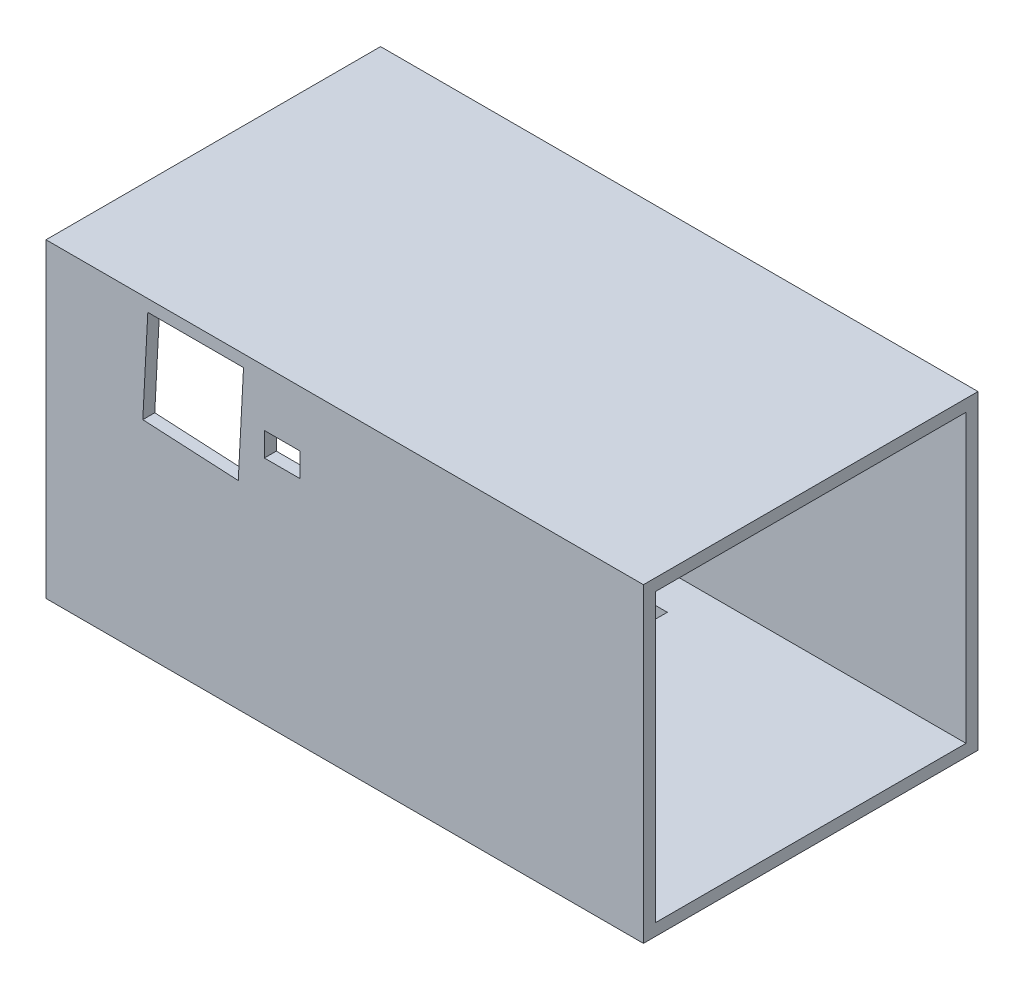
ISO-10303-21;
HEADER;
FILE_DESCRIPTION(('STEP AP214'),'2;1');
FILE_NAME('part.step','',(''),(''),'','','');
FILE_SCHEMA(('AUTOMOTIVE_DESIGN { 1 0 10303 214 1 1 1 1 }'));
ENDSEC;
DATA;
#1=APPLICATION_CONTEXT('core data for automotive mechanical design processes');
#2=APPLICATION_PROTOCOL_DEFINITION('international standard','automotive_design',2000,#1);
#3=PRODUCT_CONTEXT('',#1,'mechanical');
#4=PRODUCT('Part','Part','',(#3));
#5=PRODUCT_RELATED_PRODUCT_CATEGORY('part','',(#4));
#6=PRODUCT_DEFINITION_FORMATION('','',#4);
#7=PRODUCT_DEFINITION_CONTEXT('part definition',#1,'design');
#8=PRODUCT_DEFINITION('design','',#6,#7);
#9=PRODUCT_DEFINITION_SHAPE('','',#8);
#10=(LENGTH_UNIT() NAMED_UNIT(*) SI_UNIT(.MILLI.,.METRE.));
#11=(NAMED_UNIT(*) PLANE_ANGLE_UNIT() SI_UNIT($,.RADIAN.));
#12=(NAMED_UNIT(*) SI_UNIT($,.STERADIAN.) SOLID_ANGLE_UNIT());
#13=UNCERTAINTY_MEASURE_WITH_UNIT(LENGTH_MEASURE(1.E-05),#10,'distance_accuracy_value','');
#14=(GEOMETRIC_REPRESENTATION_CONTEXT(3) GLOBAL_UNCERTAINTY_ASSIGNED_CONTEXT((#13)) GLOBAL_UNIT_ASSIGNED_CONTEXT((#10,
#11,#12)) REPRESENTATION_CONTEXT('',''));
#15=CARTESIAN_POINT('',(0.,0.,0.));
#16=DIRECTION('',(0.,0.,1.));
#17=DIRECTION('',(1.,0.,0.));
#18=AXIS2_PLACEMENT_3D('',#15,#16,#17);
#19=CARTESIAN_POINT('',(0.,5.,0.));
#20=DIRECTION('',(0.,-1.,0.));
#21=DIRECTION('',(0.,0.,-1.));
#22=AXIS2_PLACEMENT_3D('',#19,#20,#21);
#23=PLANE('',#22);
#24=DIRECTION('',(1.,0.,0.));
#25=VECTOR('',#24,1.);
#26=CARTESIAN_POINT('',(0.,5.,-50.));
#27=LINE('',#26,#25);
#28=CARTESIAN_POINT('',(0.,5.,-50.));
#29=VERTEX_POINT('',#28);
#30=CARTESIAN_POINT('',(140.,5.,-50.));
#31=VERTEX_POINT('',#30);
#32=EDGE_CURVE('E278',#29,#31,#27,.T.);
#33=ORIENTED_EDGE('',*,*,#32,.T.);
#34=DIRECTION('',(0.,0.,1.));
#35=VECTOR('',#34,1.);
#36=CARTESIAN_POINT('',(140.,5.,0.));
#37=LINE('',#36,#35);
#38=CARTESIAN_POINT('',(140.,5.,50.));
#39=VERTEX_POINT('',#38);
#40=EDGE_CURVE('E281',#31,#39,#37,.T.);
#41=ORIENTED_EDGE('',*,*,#40,.T.);
#42=DIRECTION('',(1.,0.,0.));
#43=VECTOR('',#42,1.);
#44=CARTESIAN_POINT('',(0.,5.,50.));
#45=LINE('',#44,#43);
#46=CARTESIAN_POINT('',(0.,5.,50.));
#47=VERTEX_POINT('',#46);
#48=EDGE_CURVE('E434',#47,#39,#45,.T.);
#49=ORIENTED_EDGE('',*,*,#48,.F.);
#50=DIRECTION('',(0.,0.,1.));
#51=VECTOR('',#50,1.);
#52=CARTESIAN_POINT('',(0.,5.,0.));
#53=LINE('',#52,#51);
#54=CARTESIAN_POINT('',(0.,5.,65.));
#55=VERTEX_POINT('',#54);
#56=EDGE_CURVE('E261',#47,#55,#53,.T.);
#57=ORIENTED_EDGE('',*,*,#56,.T.);
#58=DIRECTION('',(1.,0.,0.));
#59=VECTOR('',#58,1.);
#60=CARTESIAN_POINT('',(0.,5.,65.));
#61=LINE('',#60,#59);
#62=CARTESIAN_POINT('',(250.,5.,65.));
#63=VERTEX_POINT('',#62);
#64=EDGE_CURVE('E403',#55,#63,#61,.T.);
#65=ORIENTED_EDGE('',*,*,#64,.T.);
#66=DIRECTION('',(0.,0.,-1.));
#67=VECTOR('',#66,1.);
#68=CARTESIAN_POINT('',(250.,5.,0.));
#69=LINE('',#68,#67);
#70=CARTESIAN_POINT('',(250.,5.,-65.));
#71=VERTEX_POINT('',#70);
#72=EDGE_CURVE('E350',#63,#71,#69,.T.);
#73=ORIENTED_EDGE('',*,*,#72,.T.);
#74=DIRECTION('',(1.,0.,0.));
#75=VECTOR('',#74,1.);
#76=CARTESIAN_POINT('',(0.,5.,-65.));
#77=LINE('',#76,#75);
#78=CARTESIAN_POINT('',(0.,5.,-65.));
#79=VERTEX_POINT('',#78);
#80=EDGE_CURVE('E335',#79,#71,#77,.T.);
#81=ORIENTED_EDGE('',*,*,#80,.F.);
#82=DIRECTION('',(0.,0.,-1.));
#83=VECTOR('',#82,1.);
#84=CARTESIAN_POINT('',(0.,5.,0.));
#85=LINE('',#84,#83);
#86=EDGE_CURVE('E348',#29,#79,#85,.T.);
#87=ORIENTED_EDGE('',*,*,#86,.F.);
#88=EDGE_LOOP('',(#33,#41,#49,#57,#65,#73,#81,#87));
#89=FACE_BOUND('',#88,.T.);
#90=ADVANCED_FACE('F43',(#89),#23,.F.);
#91=CARTESIAN_POINT('',(0.,5.,0.));
#92=DIRECTION('',(-1.,0.,0.));
#93=DIRECTION('',(0.,0.,1.));
#94=AXIS2_PLACEMENT_3D('',#91,#92,#93);
#95=PLANE('',#94);
#96=DIRECTION('',(0.,-1.,0.));
#97=VECTOR('',#96,1.);
#98=CARTESIAN_POINT('',(0.,5.,-50.));
#99=LINE('',#98,#97);
#100=CARTESIAN_POINT('',(0.,0.,-50.));
#101=VERTEX_POINT('',#100);
#102=EDGE_CURVE('E58',#29,#101,#99,.T.);
#103=ORIENTED_EDGE('',*,*,#102,.F.);
#104=ORIENTED_EDGE('',*,*,#86,.T.);
#105=DIRECTION('',(0.,-1.,0.));
#106=VECTOR('',#105,1.);
#107=CARTESIAN_POINT('',(0.,125.,-65.));
#108=LINE('',#107,#106);
#109=CARTESIAN_POINT('',(0.,125.,-65.));
#110=VERTEX_POINT('',#109);
#111=EDGE_CURVE('E344',#110,#79,#108,.T.);
#112=ORIENTED_EDGE('',*,*,#111,.F.);
#113=DIRECTION('',(0.,0.,1.));
#114=VECTOR('',#113,1.);
#115=CARTESIAN_POINT('',(0.,125.,-70.));
#116=LINE('',#115,#114);
#117=CARTESIAN_POINT('',(0.,125.,65.));
#118=VERTEX_POINT('',#117);
#119=EDGE_CURVE('E267',#110,#118,#116,.T.);
#120=ORIENTED_EDGE('',*,*,#119,.T.);
#121=DIRECTION('',(0.,-1.,0.));
#122=VECTOR('',#121,1.);
#123=CARTESIAN_POINT('',(0.,125.,65.));
#124=LINE('',#123,#122);
#125=EDGE_CURVE('E394',#118,#55,#124,.T.);
#126=ORIENTED_EDGE('',*,*,#125,.T.);
#127=ORIENTED_EDGE('',*,*,#56,.F.);
#128=DIRECTION('',(0.,-1.,0.));
#129=VECTOR('',#128,1.);
#130=CARTESIAN_POINT('',(0.,5.,50.));
#131=LINE('',#130,#129);
#132=CARTESIAN_POINT('',(0.,0.,50.));
#133=VERTEX_POINT('',#132);
#134=EDGE_CURVE('E411',#47,#133,#131,.T.);
#135=ORIENTED_EDGE('',*,*,#134,.T.);
#136=DIRECTION('',(0.,0.,1.));
#137=VECTOR('',#136,1.);
#138=CARTESIAN_POINT('',(0.,0.,0.));
#139=LINE('',#138,#137);
#140=CARTESIAN_POINT('',(0.,0.,70.));
#141=VERTEX_POINT('',#140);
#142=EDGE_CURVE('E397',#133,#141,#139,.T.);
#143=ORIENTED_EDGE('',*,*,#142,.T.);
#144=DIRECTION('',(0.,-1.,0.));
#145=VECTOR('',#144,1.);
#146=CARTESIAN_POINT('',(0.,5.,70.));
#147=LINE('',#146,#145);
#148=CARTESIAN_POINT('',(0.,130.,70.));
#149=VERTEX_POINT('',#148);
#150=EDGE_CURVE('E257',#149,#141,#147,.T.);
#151=ORIENTED_EDGE('',*,*,#150,.F.);
#152=DIRECTION('',(0.,0.,1.));
#153=VECTOR('',#152,1.);
#154=CARTESIAN_POINT('',(0.,130.,-70.));
#155=LINE('',#154,#153);
#156=CARTESIAN_POINT('',(0.,130.,-70.));
#157=VERTEX_POINT('',#156);
#158=EDGE_CURVE('E241',#157,#149,#155,.T.);
#159=ORIENTED_EDGE('',*,*,#158,.F.);
#160=DIRECTION('',(0.,-1.,0.));
#161=VECTOR('',#160,1.);
#162=CARTESIAN_POINT('',(0.,5.,-70.));
#163=LINE('',#162,#161);
#164=CARTESIAN_POINT('',(0.,0.,-70.));
#165=VERTEX_POINT('',#164);
#166=EDGE_CURVE('E353',#157,#165,#163,.T.);
#167=ORIENTED_EDGE('',*,*,#166,.T.);
#168=DIRECTION('',(0.,0.,-1.));
#169=VECTOR('',#168,1.);
#170=CARTESIAN_POINT('',(0.,0.,0.));
#171=LINE('',#170,#169);
#172=EDGE_CURVE('E347',#101,#165,#171,.T.);
#173=ORIENTED_EDGE('',*,*,#172,.F.);
#174=EDGE_LOOP('',(#103,#104,#112,#120,#126,#127,#135,#143,#151,#159,#167,#173));
#175=FACE_BOUND('',#174,.T.);
#176=ADVANCED_FACE('F45',(#175),#95,.T.);
#177=CARTESIAN_POINT('',(250.,5.,0.));
#178=DIRECTION('',(-1.,0.,0.));
#179=DIRECTION('',(0.,0.,1.));
#180=AXIS2_PLACEMENT_3D('',#177,#178,#179);
#181=PLANE('',#180);
#182=DIRECTION('',(0.,-1.,0.));
#183=VECTOR('',#182,1.);
#184=CARTESIAN_POINT('',(250.,5.,70.));
#185=LINE('',#184,#183);
#186=CARTESIAN_POINT('',(250.,130.,70.));
#187=VERTEX_POINT('',#186);
#188=CARTESIAN_POINT('',(250.,0.,70.));
#189=VERTEX_POINT('',#188);
#190=EDGE_CURVE('E235',#187,#189,#185,.T.);
#191=ORIENTED_EDGE('',*,*,#190,.T.);
#192=DIRECTION('',(0.,0.,-1.));
#193=VECTOR('',#192,1.);
#194=CARTESIAN_POINT('',(250.,0.,0.));
#195=LINE('',#194,#193);
#196=CARTESIAN_POINT('',(250.,0.,-70.));
#197=VERTEX_POINT('',#196);
#198=EDGE_CURVE('E351',#189,#197,#195,.T.);
#199=ORIENTED_EDGE('',*,*,#198,.T.);
#200=DIRECTION('',(0.,-1.,0.));
#201=VECTOR('',#200,1.);
#202=CARTESIAN_POINT('',(250.,5.,-70.));
#203=LINE('',#202,#201);
#204=CARTESIAN_POINT('',(250.,130.,-70.));
#205=VERTEX_POINT('',#204);
#206=EDGE_CURVE('E236',#205,#197,#203,.T.);
#207=ORIENTED_EDGE('',*,*,#206,.F.);
#208=DIRECTION('',(0.,0.,-1.));
#209=VECTOR('',#208,1.);
#210=CARTESIAN_POINT('',(250.,130.,-70.));
#211=LINE('',#210,#209);
#212=EDGE_CURVE('E229',#187,#205,#211,.T.);
#213=ORIENTED_EDGE('',*,*,#212,.F.);
#214=EDGE_LOOP('',(#191,#199,#207,#213));
#215=FACE_BOUND('',#214,.T.);
#216=ORIENTED_EDGE('',*,*,#72,.F.);
#217=DIRECTION('',(0.,-1.,0.));
#218=VECTOR('',#217,1.);
#219=CARTESIAN_POINT('',(250.,125.,65.));
#220=LINE('',#219,#218);
#221=CARTESIAN_POINT('',(250.,125.,65.));
#222=VERTEX_POINT('',#221);
#223=EDGE_CURVE('E390',#222,#63,#220,.T.);
#224=ORIENTED_EDGE('',*,*,#223,.F.);
#225=DIRECTION('',(0.,0.,-1.));
#226=VECTOR('',#225,1.);
#227=CARTESIAN_POINT('',(250.,125.,-70.));
#228=LINE('',#227,#226);
#229=CARTESIAN_POINT('',(250.,125.,-65.));
#230=VERTEX_POINT('',#229);
#231=EDGE_CURVE('E269',#222,#230,#228,.T.);
#232=ORIENTED_EDGE('',*,*,#231,.T.);
#233=DIRECTION('',(0.,-1.,0.));
#234=VECTOR('',#233,1.);
#235=CARTESIAN_POINT('',(250.,125.,-65.));
#236=LINE('',#235,#234);
#237=EDGE_CURVE('E338',#230,#71,#236,.T.);
#238=ORIENTED_EDGE('',*,*,#237,.T.);
#239=EDGE_LOOP('',(#216,#224,#232,#238));
#240=FACE_BOUND('',#239,.T.);
#241=ADVANCED_FACE('F231',(#215,#240),#181,.F.);
#242=CARTESIAN_POINT('',(0.,5.,-70.));
#243=DIRECTION('',(0.,0.,-1.));
#244=DIRECTION('',(-1.,0.,0.));
#245=AXIS2_PLACEMENT_3D('',#242,#243,#244);
#246=PLANE('',#245);
#247=ORIENTED_EDGE('',*,*,#166,.F.);
#248=DIRECTION('',(-1.,0.,0.));
#249=VECTOR('',#248,1.);
#250=CARTESIAN_POINT('',(0.,130.,-70.));
#251=LINE('',#250,#249);
#252=EDGE_CURVE('E240',#205,#157,#251,.T.);
#253=ORIENTED_EDGE('',*,*,#252,.F.);
#254=ORIENTED_EDGE('',*,*,#206,.T.);
#255=DIRECTION('',(1.,0.,0.));
#256=VECTOR('',#255,1.);
#257=CARTESIAN_POINT('',(0.,0.,-70.));
#258=LINE('',#257,#256);
#259=EDGE_CURVE('E355',#165,#197,#258,.T.);
#260=ORIENTED_EDGE('',*,*,#259,.F.);
#261=EDGE_LOOP('',(#247,#253,#254,#260));
#262=FACE_BOUND('',#261,.T.);
#263=DIRECTION('',(0.0523359562429441,0.998629534754574,0.));
#264=VECTOR('',#263,1.);
#265=CARTESIAN_POINT('',(36.2143452317098,3.10208658821668,-70.));
#266=LINE('',#265,#264);
#267=CARTESIAN_POINT('',(40.5093059231401,85.0548186098171,-70.));
#268=VERTEX_POINT('',#267);
#269=CARTESIAN_POINT('',(42.6027441728579,125.,-70.));
#270=VERTEX_POINT('',#269);
#271=EDGE_CURVE('E322',#268,#270,#266,.T.);
#272=ORIENTED_EDGE('',*,*,#271,.F.);
#273=DIRECTION('',(-0.998629534754574,0.0523359562429443,0.));
#274=VECTOR('',#273,1.);
#275=CARTESIAN_POINT('',(4.2949606914303,86.9527320216004,-70.));
#276=LINE('',#275,#274);
#277=CARTESIAN_POINT('',(80.4544873133232,82.9613803600993,-70.));
#278=VERTEX_POINT('',#277);
#279=EDGE_CURVE('E333',#278,#268,#276,.T.);
#280=ORIENTED_EDGE('',*,*,#279,.F.);
#281=DIRECTION('',(-0.0523359562429448,-0.998629534754574,0.));
#282=VECTOR('',#281,1.);
#283=CARTESIAN_POINT('',(76.1595266218928,1.00864833849887,-70.));
#284=LINE('',#283,#282);
#285=CARTESIAN_POINT('',(82.6576380127748,125.,-70.));
#286=VERTEX_POINT('',#285);
#287=EDGE_CURVE('E303',#286,#278,#284,.T.);
#288=ORIENTED_EDGE('',*,*,#287,.F.);
#289=DIRECTION('',(-1.,0.,0.));
#290=VECTOR('',#289,1.);
#291=CARTESIAN_POINT('',(0.,125.,-70.));
#292=LINE('',#291,#290);
#293=EDGE_CURVE('E272',#286,#270,#292,.T.);
#294=ORIENTED_EDGE('',*,*,#293,.T.);
#295=EDGE_LOOP('',(#272,#280,#288,#294));
#296=FACE_BOUND('',#295,.T.);
#297=DIRECTION('',(0.,-1.,0.));
#298=VECTOR('',#297,1.);
#299=CARTESIAN_POINT('',(106.3732502627,5.,-70.));
#300=LINE('',#299,#298);
#301=CARTESIAN_POINT('',(106.3732502627,106.5861430081,-70.));
#302=VERTEX_POINT('',#301);
#303=CARTESIAN_POINT('',(106.3732502627,96.5861430081,-70.));
#304=VERTEX_POINT('',#303);
#305=EDGE_CURVE('E331',#302,#304,#300,.T.);
#306=ORIENTED_EDGE('',*,*,#305,.F.);
#307=DIRECTION('',(1.,0.,0.));
#308=VECTOR('',#307,1.);
#309=CARTESIAN_POINT('',(0.,106.5861430081,-70.));
#310=LINE('',#309,#308);
#311=CARTESIAN_POINT('',(91.3732502627,106.5861430081,-70.));
#312=VERTEX_POINT('',#311);
#313=EDGE_CURVE('E325',#312,#302,#310,.T.);
#314=ORIENTED_EDGE('',*,*,#313,.F.);
#315=DIRECTION('',(0.,1.,0.));
#316=VECTOR('',#315,1.);
#317=CARTESIAN_POINT('',(91.3732502627,5.,-70.));
#318=LINE('',#317,#316);
#319=CARTESIAN_POINT('',(91.3732502627,96.5861430081,-70.));
#320=VERTEX_POINT('',#319);
#321=EDGE_CURVE('E327',#320,#312,#318,.T.);
#322=ORIENTED_EDGE('',*,*,#321,.F.);
#323=DIRECTION('',(-1.,0.,0.));
#324=VECTOR('',#323,1.);
#325=CARTESIAN_POINT('',(0.,96.5861430081,-70.));
#326=LINE('',#325,#324);
#327=EDGE_CURVE('E329',#304,#320,#326,.T.);
#328=ORIENTED_EDGE('',*,*,#327,.F.);
#329=EDGE_LOOP('',(#306,#314,#322,#328));
#330=FACE_BOUND('',#329,.T.);
#331=ADVANCED_FACE('F372',(#262,#296,#330),#246,.T.);
#332=CARTESIAN_POINT('',(0.,0.,0.));
#333=DIRECTION('',(0.,-1.,0.));
#334=DIRECTION('',(0.,0.,-1.));
#335=AXIS2_PLACEMENT_3D('',#332,#333,#334);
#336=PLANE('',#335);
#337=DIRECTION('',(0.,0.,1.));
#338=VECTOR('',#337,1.);
#339=CARTESIAN_POINT('',(140.,0.,0.));
#340=LINE('',#339,#338);
#341=CARTESIAN_POINT('',(140.,0.,-50.));
#342=VERTEX_POINT('',#341);
#343=CARTESIAN_POINT('',(140.,0.,50.));
#344=VERTEX_POINT('',#343);
#345=EDGE_CURVE('E282',#342,#344,#340,.T.);
#346=ORIENTED_EDGE('',*,*,#345,.F.);
#347=DIRECTION('',(1.,0.,0.));
#348=VECTOR('',#347,1.);
#349=CARTESIAN_POINT('',(0.,0.,-50.));
#350=LINE('',#349,#348);
#351=EDGE_CURVE('E275',#101,#342,#350,.T.);
#352=ORIENTED_EDGE('',*,*,#351,.F.);
#353=ORIENTED_EDGE('',*,*,#172,.T.);
#354=ORIENTED_EDGE('',*,*,#259,.T.);
#355=ORIENTED_EDGE('',*,*,#198,.F.);
#356=DIRECTION('',(1.,0.,0.));
#357=VECTOR('',#356,1.);
#358=CARTESIAN_POINT('',(0.,0.,70.));
#359=LINE('',#358,#357);
#360=EDGE_CURVE('E255',#141,#189,#359,.T.);
#361=ORIENTED_EDGE('',*,*,#360,.F.);
#362=ORIENTED_EDGE('',*,*,#142,.F.);
#363=DIRECTION('',(1.,0.,0.));
#364=VECTOR('',#363,1.);
#365=CARTESIAN_POINT('',(0.,0.,50.));
#366=LINE('',#365,#364);
#367=EDGE_CURVE('E416',#133,#344,#366,.T.);
#368=ORIENTED_EDGE('',*,*,#367,.T.);
#369=EDGE_LOOP('',(#346,#352,#353,#354,#355,#361,#362,#368));
#370=FACE_BOUND('',#369,.T.);
#371=ADVANCED_FACE('F415',(#370),#336,.T.);
#372=CARTESIAN_POINT('',(0.,125.,-65.));
#373=DIRECTION('',(0.,0.,-1.));
#374=DIRECTION('',(-1.,0.,0.));
#375=AXIS2_PLACEMENT_3D('',#372,#373,#374);
#376=PLANE('',#375);
#377=DIRECTION('',(-1.,0.,0.));
#378=VECTOR('',#377,1.);
#379=CARTESIAN_POINT('',(106.3732502627,106.5861430081,-65.));
#380=LINE('',#379,#378);
#381=CARTESIAN_POINT('',(106.3732502627,106.5861430081,-65.));
#382=VERTEX_POINT('',#381);
#383=CARTESIAN_POINT('',(91.3732502627,106.5861430081,-65.));
#384=VERTEX_POINT('',#383);
#385=EDGE_CURVE('E318',#382,#384,#380,.T.);
#386=ORIENTED_EDGE('',*,*,#385,.F.);
#387=DIRECTION('',(0.,1.,0.));
#388=VECTOR('',#387,1.);
#389=CARTESIAN_POINT('',(106.3732502627,96.5861430081,-65.));
#390=LINE('',#389,#388);
#391=CARTESIAN_POINT('',(106.3732502627,96.5861430081,-65.));
#392=VERTEX_POINT('',#391);
#393=EDGE_CURVE('E294',#392,#382,#390,.T.);
#394=ORIENTED_EDGE('',*,*,#393,.F.);
#395=DIRECTION('',(1.,0.,0.));
#396=VECTOR('',#395,1.);
#397=CARTESIAN_POINT('',(106.3732502627,96.5861430081,-65.));
#398=LINE('',#397,#396);
#399=CARTESIAN_POINT('',(91.3732502627,96.5861430081,-65.));
#400=VERTEX_POINT('',#399);
#401=EDGE_CURVE('E308',#400,#392,#398,.T.);
#402=ORIENTED_EDGE('',*,*,#401,.F.);
#403=DIRECTION('',(0.,-1.,0.));
#404=VECTOR('',#403,1.);
#405=CARTESIAN_POINT('',(91.3732502627,96.5861430081,-65.));
#406=LINE('',#405,#404);
#407=EDGE_CURVE('E315',#384,#400,#406,.T.);
#408=ORIENTED_EDGE('',*,*,#407,.F.);
#409=EDGE_LOOP('',(#386,#394,#402,#408));
#410=FACE_BOUND('',#409,.T.);
#411=DIRECTION('',(0.998629534754574,-0.0523359562429443,0.));
#412=VECTOR('',#411,1.);
#413=CARTESIAN_POINT('',(40.5093059231401,85.0548186098171,-65.));
#414=LINE('',#413,#412);
#415=CARTESIAN_POINT('',(40.5093059231401,85.0548186098171,-65.));
#416=VERTEX_POINT('',#415);
#417=CARTESIAN_POINT('',(80.4544873133232,82.9613803600993,-65.));
#418=VERTEX_POINT('',#417);
#419=EDGE_CURVE('E293',#416,#418,#414,.T.);
#420=ORIENTED_EDGE('',*,*,#419,.F.);
#421=DIRECTION('',(-0.0523359562429441,-0.998629534754574,0.));
#422=VECTOR('',#421,1.);
#423=CARTESIAN_POINT('',(40.5093059231401,85.0548186098171,-65.));
#424=LINE('',#423,#422);
#425=CARTESIAN_POINT('',(42.6027441728579,125.,-65.));
#426=VERTEX_POINT('',#425);
#427=EDGE_CURVE('E290',#426,#416,#424,.T.);
#428=ORIENTED_EDGE('',*,*,#427,.F.);
#429=DIRECTION('',(1.,0.,0.));
#430=VECTOR('',#429,1.);
#431=CARTESIAN_POINT('',(0.,125.,-65.));
#432=LINE('',#431,#430);
#433=EDGE_CURVE('E336',#110,#426,#432,.T.);
#434=ORIENTED_EDGE('',*,*,#433,.F.);
#435=ORIENTED_EDGE('',*,*,#111,.T.);
#436=ORIENTED_EDGE('',*,*,#80,.T.);
#437=ORIENTED_EDGE('',*,*,#237,.F.);
#438=CARTESIAN_POINT('',(82.6576380127748,125.,-65.));
#439=VERTEX_POINT('',#438);
#440=EDGE_CURVE('E339',#439,#230,#432,.T.);
#441=ORIENTED_EDGE('',*,*,#440,.F.);
#442=DIRECTION('',(0.0523359562429448,0.998629534754574,0.));
#443=VECTOR('',#442,1.);
#444=CARTESIAN_POINT('',(80.4544873133232,82.9613803600993,-65.));
#445=LINE('',#444,#443);
#446=EDGE_CURVE('E297',#418,#439,#445,.T.);
#447=ORIENTED_EDGE('',*,*,#446,.F.);
#448=EDGE_LOOP('',(#420,#428,#434,#435,#436,#437,#441,#447));
#449=FACE_BOUND('',#448,.T.);
#450=ADVANCED_FACE('F383',(#410,#449),#376,.F.);
#451=CARTESIAN_POINT('',(40.5093059231401,85.0548186098171,-185.));
#452=DIRECTION('',(-0.998629534754574,0.0523359562429441,0.));
#453=DIRECTION('',(-0.0523359562429441,-0.998629534754574,0.));
#454=AXIS2_PLACEMENT_3D('',#451,#452,#453);
#455=PLANE('',#454);
#456=ORIENTED_EDGE('',*,*,#271,.T.);
#457=DIRECTION('',(0.,0.,1.));
#458=VECTOR('',#457,1.);
#459=CARTESIAN_POINT('',(42.6027441728579,125.,0.));
#460=LINE('',#459,#458);
#461=EDGE_CURVE('E11',#270,#426,#460,.T.);
#462=ORIENTED_EDGE('',*,*,#461,.T.);
#463=ORIENTED_EDGE('',*,*,#427,.T.);
#464=DIRECTION('',(0.,0.,1.));
#465=VECTOR('',#464,1.);
#466=CARTESIAN_POINT('',(40.5093059231401,85.0548186098171,-185.));
#467=LINE('',#466,#465);
#468=EDGE_CURVE('E300',#268,#416,#467,.T.);
#469=ORIENTED_EDGE('',*,*,#468,.F.);
#470=EDGE_LOOP('',(#456,#462,#463,#469));
#471=FACE_BOUND('',#470,.T.);
#472=ADVANCED_FACE('F378',(#471),#455,.F.);
#473=CARTESIAN_POINT('',(80.4544873133232,82.9613803600993,-185.));
#474=DIRECTION('',(0.998629534754574,-0.0523359562429448,0.));
#475=DIRECTION('',(0.0523359562429448,0.998629534754574,0.));
#476=AXIS2_PLACEMENT_3D('',#473,#474,#475);
#477=PLANE('',#476);
#478=ORIENTED_EDGE('',*,*,#287,.T.);
#479=DIRECTION('',(0.,0.,1.));
#480=VECTOR('',#479,1.);
#481=CARTESIAN_POINT('',(80.4544873133232,82.9613803600993,-185.));
#482=LINE('',#481,#480);
#483=EDGE_CURVE('E301',#278,#418,#482,.T.);
#484=ORIENTED_EDGE('',*,*,#483,.T.);
#485=ORIENTED_EDGE('',*,*,#446,.T.);
#486=DIRECTION('',(0.,0.,-1.));
#487=VECTOR('',#486,1.);
#488=CARTESIAN_POINT('',(82.6576380127748,125.,0.));
#489=LINE('',#488,#487);
#490=EDGE_CURVE('E51',#439,#286,#489,.T.);
#491=ORIENTED_EDGE('',*,*,#490,.T.);
#492=EDGE_LOOP('',(#478,#484,#485,#491));
#493=FACE_BOUND('',#492,.T.);
#494=ADVANCED_FACE('F364',(#493),#477,.F.);
#495=CARTESIAN_POINT('',(40.5093059231401,85.0548186098171,-185.));
#496=DIRECTION('',(-0.0523359562429443,-0.998629534754574,0.));
#497=DIRECTION('',(0.998629534754574,-0.0523359562429443,0.));
#498=AXIS2_PLACEMENT_3D('',#495,#496,#497);
#499=PLANE('',#498);
#500=ORIENTED_EDGE('',*,*,#279,.T.);
#501=ORIENTED_EDGE('',*,*,#468,.T.);
#502=ORIENTED_EDGE('',*,*,#419,.T.);
#503=ORIENTED_EDGE('',*,*,#483,.F.);
#504=EDGE_LOOP('',(#500,#501,#502,#503));
#505=FACE_BOUND('',#504,.T.);
#506=ADVANCED_FACE('F376',(#505),#499,.F.);
#507=CARTESIAN_POINT('',(106.3732502627,96.5861430081,-185.));
#508=DIRECTION('',(1.,0.,0.));
#509=DIRECTION('',(0.,0.,-1.));
#510=AXIS2_PLACEMENT_3D('',#507,#508,#509);
#511=PLANE('',#510);
#512=ORIENTED_EDGE('',*,*,#305,.T.);
#513=DIRECTION('',(0.,0.,1.));
#514=VECTOR('',#513,1.);
#515=CARTESIAN_POINT('',(106.3732502627,96.5861430081,-185.));
#516=LINE('',#515,#514);
#517=EDGE_CURVE('E288',#304,#392,#516,.T.);
#518=ORIENTED_EDGE('',*,*,#517,.T.);
#519=ORIENTED_EDGE('',*,*,#393,.T.);
#520=DIRECTION('',(0.,0.,1.));
#521=VECTOR('',#520,1.);
#522=CARTESIAN_POINT('',(106.3732502627,106.5861430081,-185.));
#523=LINE('',#522,#521);
#524=EDGE_CURVE('E305',#302,#382,#523,.T.);
#525=ORIENTED_EDGE('',*,*,#524,.F.);
#526=EDGE_LOOP('',(#512,#518,#519,#525));
#527=FACE_BOUND('',#526,.T.);
#528=ADVANCED_FACE('F569',(#527),#511,.F.);
#529=CARTESIAN_POINT('',(106.3732502627,96.5861430081,-185.));
#530=DIRECTION('',(0.,-1.,0.));
#531=DIRECTION('',(0.,0.,-1.));
#532=AXIS2_PLACEMENT_3D('',#529,#530,#531);
#533=PLANE('',#532);
#534=ORIENTED_EDGE('',*,*,#327,.T.);
#535=DIRECTION('',(0.,0.,1.));
#536=VECTOR('',#535,1.);
#537=CARTESIAN_POINT('',(91.3732502627,96.5861430081,-185.));
#538=LINE('',#537,#536);
#539=EDGE_CURVE('E310',#320,#400,#538,.T.);
#540=ORIENTED_EDGE('',*,*,#539,.T.);
#541=ORIENTED_EDGE('',*,*,#401,.T.);
#542=ORIENTED_EDGE('',*,*,#517,.F.);
#543=EDGE_LOOP('',(#534,#540,#541,#542));
#544=FACE_BOUND('',#543,.T.);
#545=ADVANCED_FACE('F576',(#544),#533,.F.);
#546=CARTESIAN_POINT('',(91.3732502627,96.5861430081,-185.));
#547=DIRECTION('',(-1.,0.,0.));
#548=DIRECTION('',(0.,0.,1.));
#549=AXIS2_PLACEMENT_3D('',#546,#547,#548);
#550=PLANE('',#549);
#551=ORIENTED_EDGE('',*,*,#321,.T.);
#552=DIRECTION('',(0.,0.,1.));
#553=VECTOR('',#552,1.);
#554=CARTESIAN_POINT('',(91.3732502627,106.5861430081,-185.));
#555=LINE('',#554,#553);
#556=EDGE_CURVE('E66',#312,#384,#555,.T.);
#557=ORIENTED_EDGE('',*,*,#556,.T.);
#558=ORIENTED_EDGE('',*,*,#407,.T.);
#559=ORIENTED_EDGE('',*,*,#539,.F.);
#560=EDGE_LOOP('',(#551,#557,#558,#559));
#561=FACE_BOUND('',#560,.T.);
#562=ADVANCED_FACE('F584',(#561),#550,.F.);
#563=CARTESIAN_POINT('',(106.3732502627,106.5861430081,-185.));
#564=DIRECTION('',(0.,1.,0.));
#565=DIRECTION('',(0.,0.,1.));
#566=AXIS2_PLACEMENT_3D('',#563,#564,#565);
#567=PLANE('',#566);
#568=ORIENTED_EDGE('',*,*,#313,.T.);
#569=ORIENTED_EDGE('',*,*,#524,.T.);
#570=ORIENTED_EDGE('',*,*,#385,.T.);
#571=ORIENTED_EDGE('',*,*,#556,.F.);
#572=EDGE_LOOP('',(#568,#569,#570,#571));
#573=FACE_BOUND('',#572,.T.);
#574=ADVANCED_FACE('F591',(#573),#567,.F.);
#575=CARTESIAN_POINT('',(140.,5.,0.));
#576=DIRECTION('',(1.,0.,0.));
#577=DIRECTION('',(0.,0.,-1.));
#578=AXIS2_PLACEMENT_3D('',#575,#576,#577);
#579=PLANE('',#578);
#580=ORIENTED_EDGE('',*,*,#345,.T.);
#581=DIRECTION('',(0.,-1.,0.));
#582=VECTOR('',#581,1.);
#583=CARTESIAN_POINT('',(140.,5.,50.));
#584=LINE('',#583,#582);
#585=EDGE_CURVE('E440',#39,#344,#584,.T.);
#586=ORIENTED_EDGE('',*,*,#585,.F.);
#587=ORIENTED_EDGE('',*,*,#40,.F.);
#588=DIRECTION('',(0.,-1.,0.));
#589=VECTOR('',#588,1.);
#590=CARTESIAN_POINT('',(140.,5.,-50.));
#591=LINE('',#590,#589);
#592=EDGE_CURVE('E286',#31,#342,#591,.T.);
#593=ORIENTED_EDGE('',*,*,#592,.T.);
#594=EDGE_LOOP('',(#580,#586,#587,#593));
#595=FACE_BOUND('',#594,.T.);
#596=ADVANCED_FACE('F599',(#595),#579,.F.);
#597=CARTESIAN_POINT('',(0.,5.,-50.));
#598=DIRECTION('',(0.,0.,-1.));
#599=DIRECTION('',(-1.,0.,0.));
#600=AXIS2_PLACEMENT_3D('',#597,#598,#599);
#601=PLANE('',#600);
#602=ORIENTED_EDGE('',*,*,#351,.T.);
#603=ORIENTED_EDGE('',*,*,#592,.F.);
#604=ORIENTED_EDGE('',*,*,#32,.F.);
#605=ORIENTED_EDGE('',*,*,#102,.T.);
#606=EDGE_LOOP('',(#602,#603,#604,#605));
#607=FACE_BOUND('',#606,.T.);
#608=ADVANCED_FACE('F606',(#607),#601,.F.);
#609=CARTESIAN_POINT('',(0.,125.,0.));
#610=DIRECTION('',(0.,1.,0.));
#611=DIRECTION('',(0.,0.,1.));
#612=AXIS2_PLACEMENT_3D('',#609,#610,#611);
#613=PLANE('',#612);
#614=ORIENTED_EDGE('',*,*,#119,.F.);
#615=ORIENTED_EDGE('',*,*,#433,.T.);
#616=ORIENTED_EDGE('',*,*,#461,.F.);
#617=ORIENTED_EDGE('',*,*,#293,.F.);
#618=ORIENTED_EDGE('',*,*,#490,.F.);
#619=ORIENTED_EDGE('',*,*,#440,.T.);
#620=ORIENTED_EDGE('',*,*,#231,.F.);
#621=DIRECTION('',(1.,0.,0.));
#622=VECTOR('',#621,1.);
#623=CARTESIAN_POINT('',(0.,125.,65.));
#624=LINE('',#623,#622);
#625=CARTESIAN_POINT('',(82.6576380127748,125.,65.));
#626=VERTEX_POINT('',#625);
#627=EDGE_CURVE('E400',#626,#222,#624,.T.);
#628=ORIENTED_EDGE('',*,*,#627,.F.);
#629=DIRECTION('',(0.,0.,1.));
#630=VECTOR('',#629,1.);
#631=CARTESIAN_POINT('',(82.6576380127748,125.,0.));
#632=LINE('',#631,#630);
#633=CARTESIAN_POINT('',(82.6576380127748,125.,70.));
#634=VERTEX_POINT('',#633);
#635=EDGE_CURVE('E256',#626,#634,#632,.T.);
#636=ORIENTED_EDGE('',*,*,#635,.T.);
#637=DIRECTION('',(-1.,0.,0.));
#638=VECTOR('',#637,1.);
#639=CARTESIAN_POINT('',(0.,125.,70.));
#640=LINE('',#639,#638);
#641=CARTESIAN_POINT('',(42.6027441728579,125.,70.));
#642=VERTEX_POINT('',#641);
#643=EDGE_CURVE('E250',#634,#642,#640,.T.);
#644=ORIENTED_EDGE('',*,*,#643,.T.);
#645=DIRECTION('',(0.,0.,-1.));
#646=VECTOR('',#645,1.);
#647=CARTESIAN_POINT('',(42.6027441728579,125.,0.));
#648=LINE('',#647,#646);
#649=CARTESIAN_POINT('',(42.6027441728579,125.,65.));
#650=VERTEX_POINT('',#649);
#651=EDGE_CURVE('E259',#642,#650,#648,.T.);
#652=ORIENTED_EDGE('',*,*,#651,.T.);
#653=EDGE_CURVE('E395',#118,#650,#624,.T.);
#654=ORIENTED_EDGE('',*,*,#653,.F.);
#655=EDGE_LOOP('',(#614,#615,#616,#617,#618,#619,#620,#628,#636,#644,#652,#654));
#656=FACE_BOUND('',#655,.T.);
#657=ADVANCED_FACE('F385',(#656),#613,.F.);
#658=CARTESIAN_POINT('',(0.,130.,0.));
#659=DIRECTION('',(0.,1.,0.));
#660=DIRECTION('',(0.,0.,1.));
#661=AXIS2_PLACEMENT_3D('',#658,#659,#660);
#662=PLANE('',#661);
#663=ORIENTED_EDGE('',*,*,#158,.T.);
#664=DIRECTION('',(-1.,0.,0.));
#665=VECTOR('',#664,1.);
#666=CARTESIAN_POINT('',(0.,130.,70.));
#667=LINE('',#666,#665);
#668=EDGE_CURVE('E244',#187,#149,#667,.T.);
#669=ORIENTED_EDGE('',*,*,#668,.F.);
#670=ORIENTED_EDGE('',*,*,#212,.T.);
#671=ORIENTED_EDGE('',*,*,#252,.T.);
#672=EDGE_LOOP('',(#663,#669,#670,#671));
#673=FACE_BOUND('',#672,.T.);
#674=ADVANCED_FACE('F245',(#673),#662,.T.);
#675=CARTESIAN_POINT('',(0.,5.,70.));
#676=DIRECTION('',(0.,0.,1.));
#677=DIRECTION('',(-1.,0.,0.));
#678=AXIS2_PLACEMENT_3D('',#675,#676,#677);
#679=PLANE('',#678);
#680=ORIENTED_EDGE('',*,*,#150,.T.);
#681=ORIENTED_EDGE('',*,*,#360,.T.);
#682=ORIENTED_EDGE('',*,*,#190,.F.);
#683=ORIENTED_EDGE('',*,*,#668,.T.);
#684=EDGE_LOOP('',(#680,#681,#682,#683));
#685=FACE_BOUND('',#684,.T.);
#686=DIRECTION('',(0.0523359562429441,0.998629534754574,0.));
#687=VECTOR('',#686,1.);
#688=CARTESIAN_POINT('',(36.2143452317098,3.10208658821668,70.));
#689=LINE('',#688,#687);
#690=CARTESIAN_POINT('',(40.5093059231401,85.0548186098171,70.));
#691=VERTEX_POINT('',#690);
#692=EDGE_CURVE('E480',#691,#642,#689,.T.);
#693=ORIENTED_EDGE('',*,*,#692,.T.);
#694=ORIENTED_EDGE('',*,*,#643,.F.);
#695=DIRECTION('',(-0.0523359562429448,-0.998629534754574,0.));
#696=VECTOR('',#695,1.);
#697=CARTESIAN_POINT('',(76.1595266218928,1.00864833849887,70.));
#698=LINE('',#697,#696);
#699=CARTESIAN_POINT('',(80.4544873133232,82.9613803600993,70.));
#700=VERTEX_POINT('',#699);
#701=EDGE_CURVE('E458',#634,#700,#698,.T.);
#702=ORIENTED_EDGE('',*,*,#701,.T.);
#703=DIRECTION('',(-0.998629534754574,0.0523359562429443,0.));
#704=VECTOR('',#703,1.);
#705=CARTESIAN_POINT('',(4.2949606914303,86.9527320216004,70.));
#706=LINE('',#705,#704);
#707=EDGE_CURVE('E431',#700,#691,#706,.T.);
#708=ORIENTED_EDGE('',*,*,#707,.T.);
#709=EDGE_LOOP('',(#693,#694,#702,#708));
#710=FACE_BOUND('',#709,.T.);
#711=DIRECTION('',(0.,-1.,0.));
#712=VECTOR('',#711,1.);
#713=CARTESIAN_POINT('',(106.3732502627,5.,70.));
#714=LINE('',#713,#712);
#715=CARTESIAN_POINT('',(106.3732502627,106.5861430081,70.));
#716=VERTEX_POINT('',#715);
#717=CARTESIAN_POINT('',(106.3732502627,96.5861430081,70.));
#718=VERTEX_POINT('',#717);
#719=EDGE_CURVE('E492',#716,#718,#714,.T.);
#720=ORIENTED_EDGE('',*,*,#719,.T.);
#721=DIRECTION('',(-1.,0.,0.));
#722=VECTOR('',#721,1.);
#723=CARTESIAN_POINT('',(0.,96.5861430081,70.));
#724=LINE('',#723,#722);
#725=CARTESIAN_POINT('',(91.3732502627,96.5861430081,70.));
#726=VERTEX_POINT('',#725);
#727=EDGE_CURVE('E489',#718,#726,#724,.T.);
#728=ORIENTED_EDGE('',*,*,#727,.T.);
#729=DIRECTION('',(0.,1.,0.));
#730=VECTOR('',#729,1.);
#731=CARTESIAN_POINT('',(91.3732502627,5.,70.));
#732=LINE('',#731,#730);
#733=CARTESIAN_POINT('',(91.3732502627,106.5861430081,70.));
#734=VERTEX_POINT('',#733);
#735=EDGE_CURVE('E486',#726,#734,#732,.T.);
#736=ORIENTED_EDGE('',*,*,#735,.T.);
#737=DIRECTION('',(1.,0.,0.));
#738=VECTOR('',#737,1.);
#739=CARTESIAN_POINT('',(0.,106.5861430081,70.));
#740=LINE('',#739,#738);
#741=EDGE_CURVE('E483',#734,#716,#740,.T.);
#742=ORIENTED_EDGE('',*,*,#741,.T.);
#743=EDGE_LOOP('',(#720,#728,#736,#742));
#744=FACE_BOUND('',#743,.T.);
#745=ADVANCED_FACE('F253',(#685,#710,#744),#679,.T.);
#746=CARTESIAN_POINT('',(0.,125.,65.));
#747=DIRECTION('',(0.,0.,1.));
#748=DIRECTION('',(-1.,0.,0.));
#749=AXIS2_PLACEMENT_3D('',#746,#747,#748);
#750=PLANE('',#749);
#751=DIRECTION('',(-1.,0.,0.));
#752=VECTOR('',#751,1.);
#753=CARTESIAN_POINT('',(106.3732502627,106.5861430081,65.));
#754=LINE('',#753,#752);
#755=CARTESIAN_POINT('',(106.3732502627,106.5861430081,65.));
#756=VERTEX_POINT('',#755);
#757=CARTESIAN_POINT('',(91.3732502627,106.5861430081,65.));
#758=VERTEX_POINT('',#757);
#759=EDGE_CURVE('E473',#756,#758,#754,.T.);
#760=ORIENTED_EDGE('',*,*,#759,.T.);
#761=DIRECTION('',(0.,-1.,0.));
#762=VECTOR('',#761,1.);
#763=CARTESIAN_POINT('',(91.3732502627,96.5861430081,65.));
#764=LINE('',#763,#762);
#765=CARTESIAN_POINT('',(91.3732502627,96.5861430081,65.));
#766=VERTEX_POINT('',#765);
#767=EDGE_CURVE('E470',#758,#766,#764,.T.);
#768=ORIENTED_EDGE('',*,*,#767,.T.);
#769=DIRECTION('',(1.,0.,0.));
#770=VECTOR('',#769,1.);
#771=CARTESIAN_POINT('',(106.3732502627,96.5861430081,65.));
#772=LINE('',#771,#770);
#773=CARTESIAN_POINT('',(106.3732502627,96.5861430081,65.));
#774=VERTEX_POINT('',#773);
#775=EDGE_CURVE('E462',#766,#774,#772,.T.);
#776=ORIENTED_EDGE('',*,*,#775,.T.);
#777=DIRECTION('',(0.,1.,0.));
#778=VECTOR('',#777,1.);
#779=CARTESIAN_POINT('',(106.3732502627,96.5861430081,65.));
#780=LINE('',#779,#778);
#781=EDGE_CURVE('E450',#774,#756,#780,.T.);
#782=ORIENTED_EDGE('',*,*,#781,.T.);
#783=EDGE_LOOP('',(#760,#768,#776,#782));
#784=FACE_BOUND('',#783,.T.);
#785=DIRECTION('',(0.998629534754574,-0.0523359562429443,0.));
#786=VECTOR('',#785,1.);
#787=CARTESIAN_POINT('',(40.5093059231401,85.0548186098171,65.));
#788=LINE('',#787,#786);
#789=CARTESIAN_POINT('',(40.5093059231401,85.0548186098171,65.));
#790=VERTEX_POINT('',#789);
#791=CARTESIAN_POINT('',(80.4544873133232,82.9613803600993,65.));
#792=VERTEX_POINT('',#791);
#793=EDGE_CURVE('E449',#790,#792,#788,.T.);
#794=ORIENTED_EDGE('',*,*,#793,.T.);
#795=DIRECTION('',(0.0523359562429448,0.998629534754574,0.));
#796=VECTOR('',#795,1.);
#797=CARTESIAN_POINT('',(80.4544873133232,82.9613803600993,65.));
#798=LINE('',#797,#796);
#799=EDGE_CURVE('E452',#792,#626,#798,.T.);
#800=ORIENTED_EDGE('',*,*,#799,.T.);
#801=ORIENTED_EDGE('',*,*,#627,.T.);
#802=ORIENTED_EDGE('',*,*,#223,.T.);
#803=ORIENTED_EDGE('',*,*,#64,.F.);
#804=ORIENTED_EDGE('',*,*,#125,.F.);
#805=ORIENTED_EDGE('',*,*,#653,.T.);
#806=DIRECTION('',(-0.0523359562429441,-0.998629534754574,0.));
#807=VECTOR('',#806,1.);
#808=CARTESIAN_POINT('',(40.5093059231401,85.0548186098171,65.));
#809=LINE('',#808,#807);
#810=EDGE_CURVE('E447',#650,#790,#809,.T.);
#811=ORIENTED_EDGE('',*,*,#810,.T.);
#812=EDGE_LOOP('',(#794,#800,#801,#802,#803,#804,#805,#811));
#813=FACE_BOUND('',#812,.T.);
#814=ADVANCED_FACE('F430',(#784,#813),#750,.F.);
#815=CARTESIAN_POINT('',(40.5093059231401,85.0548186098171,185.));
#816=DIRECTION('',(-0.998629534754574,0.0523359562429441,0.));
#817=DIRECTION('',(-0.0523359562429441,-0.998629534754574,0.));
#818=AXIS2_PLACEMENT_3D('',#815,#816,#817);
#819=PLANE('',#818);
#820=ORIENTED_EDGE('',*,*,#692,.F.);
#821=DIRECTION('',(0.,0.,-1.));
#822=VECTOR('',#821,1.);
#823=CARTESIAN_POINT('',(40.5093059231401,85.0548186098171,185.));
#824=LINE('',#823,#822);
#825=EDGE_CURVE('E455',#691,#790,#824,.T.);
#826=ORIENTED_EDGE('',*,*,#825,.T.);
#827=ORIENTED_EDGE('',*,*,#810,.F.);
#828=ORIENTED_EDGE('',*,*,#651,.F.);
#829=EDGE_LOOP('',(#820,#826,#827,#828));
#830=FACE_BOUND('',#829,.T.);
#831=ADVANCED_FACE('F503',(#830),#819,.F.);
#832=CARTESIAN_POINT('',(80.4544873133232,82.9613803600993,185.));
#833=DIRECTION('',(0.998629534754574,-0.0523359562429448,0.));
#834=DIRECTION('',(0.0523359562429448,0.998629534754574,0.));
#835=AXIS2_PLACEMENT_3D('',#832,#833,#834);
#836=PLANE('',#835);
#837=ORIENTED_EDGE('',*,*,#701,.F.);
#838=ORIENTED_EDGE('',*,*,#635,.F.);
#839=ORIENTED_EDGE('',*,*,#799,.F.);
#840=DIRECTION('',(0.,0.,-1.));
#841=VECTOR('',#840,1.);
#842=CARTESIAN_POINT('',(80.4544873133232,82.9613803600993,185.));
#843=LINE('',#842,#841);
#844=EDGE_CURVE('E456',#700,#792,#843,.T.);
#845=ORIENTED_EDGE('',*,*,#844,.F.);
#846=EDGE_LOOP('',(#837,#838,#839,#845));
#847=FACE_BOUND('',#846,.T.);
#848=ADVANCED_FACE('F506',(#847),#836,.F.);
#849=CARTESIAN_POINT('',(40.5093059231401,85.0548186098171,185.));
#850=DIRECTION('',(-0.0523359562429443,-0.998629534754574,0.));
#851=DIRECTION('',(0.998629534754574,-0.0523359562429443,0.));
#852=AXIS2_PLACEMENT_3D('',#849,#850,#851);
#853=PLANE('',#852);
#854=ORIENTED_EDGE('',*,*,#707,.F.);
#855=ORIENTED_EDGE('',*,*,#844,.T.);
#856=ORIENTED_EDGE('',*,*,#793,.F.);
#857=ORIENTED_EDGE('',*,*,#825,.F.);
#858=EDGE_LOOP('',(#854,#855,#856,#857));
#859=FACE_BOUND('',#858,.T.);
#860=ADVANCED_FACE('F508',(#859),#853,.F.);
#861=CARTESIAN_POINT('',(106.3732502627,96.5861430081,185.));
#862=DIRECTION('',(1.,0.,0.));
#863=DIRECTION('',(0.,0.,1.));
#864=AXIS2_PLACEMENT_3D('',#861,#862,#863);
#865=PLANE('',#864);
#866=ORIENTED_EDGE('',*,*,#719,.F.);
#867=DIRECTION('',(0.,0.,-1.));
#868=VECTOR('',#867,1.);
#869=CARTESIAN_POINT('',(106.3732502627,106.5861430081,185.));
#870=LINE('',#869,#868);
#871=EDGE_CURVE('E460',#716,#756,#870,.T.);
#872=ORIENTED_EDGE('',*,*,#871,.T.);
#873=ORIENTED_EDGE('',*,*,#781,.F.);
#874=DIRECTION('',(0.,0.,-1.));
#875=VECTOR('',#874,1.);
#876=CARTESIAN_POINT('',(106.3732502627,96.5861430081,185.));
#877=LINE('',#876,#875);
#878=EDGE_CURVE('E445',#718,#774,#877,.T.);
#879=ORIENTED_EDGE('',*,*,#878,.F.);
#880=EDGE_LOOP('',(#866,#872,#873,#879));
#881=FACE_BOUND('',#880,.T.);
#882=ADVANCED_FACE('F510',(#881),#865,.F.);
#883=CARTESIAN_POINT('',(106.3732502627,96.5861430081,185.));
#884=DIRECTION('',(0.,-1.,0.));
#885=DIRECTION('',(0.,0.,1.));
#886=AXIS2_PLACEMENT_3D('',#883,#884,#885);
#887=PLANE('',#886);
#888=ORIENTED_EDGE('',*,*,#727,.F.);
#889=ORIENTED_EDGE('',*,*,#878,.T.);
#890=ORIENTED_EDGE('',*,*,#775,.F.);
#891=DIRECTION('',(0.,0.,-1.));
#892=VECTOR('',#891,1.);
#893=CARTESIAN_POINT('',(91.3732502627,96.5861430081,185.));
#894=LINE('',#893,#892);
#895=EDGE_CURVE('E465',#726,#766,#894,.T.);
#896=ORIENTED_EDGE('',*,*,#895,.F.);
#897=EDGE_LOOP('',(#888,#889,#890,#896));
#898=FACE_BOUND('',#897,.T.);
#899=ADVANCED_FACE('F516',(#898),#887,.F.);
#900=CARTESIAN_POINT('',(91.3732502627,96.5861430081,185.));
#901=DIRECTION('',(-1.,0.,0.));
#902=DIRECTION('',(0.,0.,-1.));
#903=AXIS2_PLACEMENT_3D('',#900,#901,#902);
#904=PLANE('',#903);
#905=ORIENTED_EDGE('',*,*,#735,.F.);
#906=ORIENTED_EDGE('',*,*,#895,.T.);
#907=ORIENTED_EDGE('',*,*,#767,.F.);
#908=DIRECTION('',(0.,0.,-1.));
#909=VECTOR('',#908,1.);
#910=CARTESIAN_POINT('',(91.3732502627,106.5861430081,185.));
#911=LINE('',#910,#909);
#912=EDGE_CURVE('E463',#734,#758,#911,.T.);
#913=ORIENTED_EDGE('',*,*,#912,.F.);
#914=EDGE_LOOP('',(#905,#906,#907,#913));
#915=FACE_BOUND('',#914,.T.);
#916=ADVANCED_FACE('F669',(#915),#904,.F.);
#917=CARTESIAN_POINT('',(106.3732502627,106.5861430081,185.));
#918=DIRECTION('',(0.,1.,0.));
#919=DIRECTION('',(0.,0.,-1.));
#920=AXIS2_PLACEMENT_3D('',#917,#918,#919);
#921=PLANE('',#920);
#922=ORIENTED_EDGE('',*,*,#741,.F.);
#923=ORIENTED_EDGE('',*,*,#912,.T.);
#924=ORIENTED_EDGE('',*,*,#759,.F.);
#925=ORIENTED_EDGE('',*,*,#871,.F.);
#926=EDGE_LOOP('',(#922,#923,#924,#925));
#927=FACE_BOUND('',#926,.T.);
#928=ADVANCED_FACE('F680',(#927),#921,.F.);
#929=CARTESIAN_POINT('',(0.,5.,50.));
#930=DIRECTION('',(0.,0.,1.));
#931=DIRECTION('',(-1.,0.,0.));
#932=AXIS2_PLACEMENT_3D('',#929,#930,#931);
#933=PLANE('',#932);
#934=ORIENTED_EDGE('',*,*,#367,.F.);
#935=ORIENTED_EDGE('',*,*,#134,.F.);
#936=ORIENTED_EDGE('',*,*,#48,.T.);
#937=ORIENTED_EDGE('',*,*,#585,.T.);
#938=EDGE_LOOP('',(#934,#935,#936,#937));
#939=FACE_BOUND('',#938,.T.);
#940=ADVANCED_FACE('F691',(#939),#933,.F.);
#941=CLOSED_SHELL('',(#90,#176,#241,#331,#371,#450,#472,#494,#506,#528,#545,#562,#574,#596,#608,
#657,#674,#745,#814,#831,#848,#860,#882,#899,#916,#928,#940));
#942=MANIFOLD_SOLID_BREP('B2',#941);
#943=ADVANCED_BREP_SHAPE_REPRESENTATION('',(#18,#942),#14);
#944=SHAPE_DEFINITION_REPRESENTATION(#9,#943);
ENDSEC;
END-ISO-10303-21;
